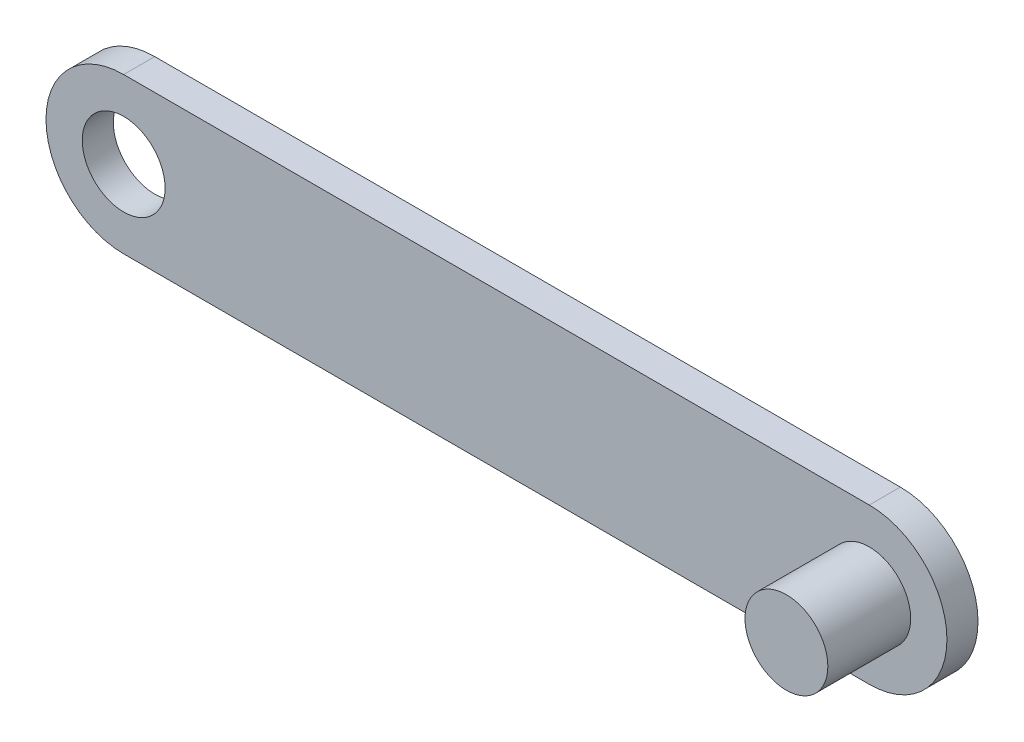
ISO-10303-21;
HEADER;
FILE_DESCRIPTION(('STEP AP214'),'2;1');
FILE_NAME('part.step','',(''),(''),'','','');
FILE_SCHEMA(('AUTOMOTIVE_DESIGN { 1 0 10303 214 1 1 1 1 }'));
ENDSEC;
DATA;
#1=APPLICATION_CONTEXT('core data for automotive mechanical design processes');
#2=APPLICATION_PROTOCOL_DEFINITION('international standard','automotive_design',2000,#1);
#3=PRODUCT_CONTEXT('',#1,'mechanical');
#4=PRODUCT('Part','Part','',(#3));
#5=PRODUCT_RELATED_PRODUCT_CATEGORY('part','',(#4));
#6=PRODUCT_DEFINITION_FORMATION('','',#4);
#7=PRODUCT_DEFINITION_CONTEXT('part definition',#1,'design');
#8=PRODUCT_DEFINITION('design','',#6,#7);
#9=PRODUCT_DEFINITION_SHAPE('','',#8);
#10=(LENGTH_UNIT() NAMED_UNIT(*) SI_UNIT(.MILLI.,.METRE.));
#11=(NAMED_UNIT(*) PLANE_ANGLE_UNIT() SI_UNIT($,.RADIAN.));
#12=(NAMED_UNIT(*) SI_UNIT($,.STERADIAN.) SOLID_ANGLE_UNIT());
#13=UNCERTAINTY_MEASURE_WITH_UNIT(LENGTH_MEASURE(1.E-05),#10,'distance_accuracy_value','');
#14=(GEOMETRIC_REPRESENTATION_CONTEXT(3) GLOBAL_UNCERTAINTY_ASSIGNED_CONTEXT((#13)) GLOBAL_UNIT_ASSIGNED_CONTEXT((#10,
#11,#12)) REPRESENTATION_CONTEXT('',''));
#15=CARTESIAN_POINT('',(0.,0.,0.));
#16=DIRECTION('',(0.,0.,1.));
#17=DIRECTION('',(1.,0.,0.));
#18=AXIS2_PLACEMENT_3D('',#15,#16,#17);
#19=CARTESIAN_POINT('',(0.,0.,3.));
#20=DIRECTION('',(0.,0.,-1.));
#21=DIRECTION('',(-1.,0.,0.));
#22=AXIS2_PLACEMENT_3D('',#19,#20,#21);
#23=CYLINDRICAL_SURFACE('',#22,7.5);
#24=CARTESIAN_POINT('',(0.,0.,0.));
#25=DIRECTION('',(0.,0.,1.));
#26=DIRECTION('',(1.,0.,0.));
#27=AXIS2_PLACEMENT_3D('',#24,#25,#26);
#28=CIRCLE('',#27,7.5);
#29=CARTESIAN_POINT('',(0.,7.5,0.));
#30=VERTEX_POINT('',#29);
#31=CARTESIAN_POINT('',(0.,-7.5,0.));
#32=VERTEX_POINT('',#31);
#33=EDGE_CURVE('E107',#30,#32,#28,.T.);
#34=ORIENTED_EDGE('',*,*,#33,.T.);
#35=DIRECTION('',(0.,0.,-1.));
#36=VECTOR('',#35,1.);
#37=CARTESIAN_POINT('',(0.,-7.5,3.));
#38=LINE('',#37,#36);
#39=CARTESIAN_POINT('',(0.,-7.5,3.));
#40=VERTEX_POINT('',#39);
#41=EDGE_CURVE('E11',#40,#32,#38,.T.);
#42=ORIENTED_EDGE('',*,*,#41,.F.);
#43=CARTESIAN_POINT('',(0.,0.,3.));
#44=DIRECTION('',(0.,0.,1.));
#45=DIRECTION('',(1.,0.,0.));
#46=AXIS2_PLACEMENT_3D('',#43,#44,#45);
#47=CIRCLE('',#46,7.5);
#48=CARTESIAN_POINT('',(0.,7.5,3.));
#49=VERTEX_POINT('',#48);
#50=EDGE_CURVE('E91',#49,#40,#47,.T.);
#51=ORIENTED_EDGE('',*,*,#50,.F.);
#52=DIRECTION('',(0.,0.,-1.));
#53=VECTOR('',#52,1.);
#54=CARTESIAN_POINT('',(0.,7.5,3.));
#55=LINE('',#54,#53);
#56=EDGE_CURVE('E103',#49,#30,#55,.T.);
#57=ORIENTED_EDGE('',*,*,#56,.T.);
#58=EDGE_LOOP('',(#34,#42,#51,#57));
#59=FACE_BOUND('',#58,.T.);
#60=ADVANCED_FACE('F39',(#59),#23,.T.);
#61=CARTESIAN_POINT('',(0.,-7.5,3.));
#62=DIRECTION('',(0.,1.,0.));
#63=DIRECTION('',(-1.,0.,0.));
#64=AXIS2_PLACEMENT_3D('',#61,#62,#63);
#65=PLANE('',#64);
#66=DIRECTION('',(1.,0.,0.));
#67=VECTOR('',#66,1.);
#68=CARTESIAN_POINT('',(0.,-7.5,0.));
#69=LINE('',#68,#67);
#70=CARTESIAN_POINT('',(72.,-7.5,0.));
#71=VERTEX_POINT('',#70);
#72=EDGE_CURVE('E96',#32,#71,#69,.T.);
#73=ORIENTED_EDGE('',*,*,#72,.T.);
#74=DIRECTION('',(0.,0.,-1.));
#75=VECTOR('',#74,1.);
#76=CARTESIAN_POINT('',(72.,-7.5,3.));
#77=LINE('',#76,#75);
#78=CARTESIAN_POINT('',(72.,-7.5,3.));
#79=VERTEX_POINT('',#78);
#80=EDGE_CURVE('E48',#79,#71,#77,.T.);
#81=ORIENTED_EDGE('',*,*,#80,.F.);
#82=DIRECTION('',(1.,0.,0.));
#83=VECTOR('',#82,1.);
#84=CARTESIAN_POINT('',(0.,-7.5,3.));
#85=LINE('',#84,#83);
#86=EDGE_CURVE('E86',#40,#79,#85,.T.);
#87=ORIENTED_EDGE('',*,*,#86,.F.);
#88=ORIENTED_EDGE('',*,*,#41,.T.);
#89=EDGE_LOOP('',(#73,#81,#87,#88));
#90=FACE_BOUND('',#89,.T.);
#91=ADVANCED_FACE('F95',(#90),#65,.F.);
#92=CARTESIAN_POINT('',(72.,0.,3.));
#93=DIRECTION('',(0.,0.,-1.));
#94=DIRECTION('',(-1.,0.,0.));
#95=AXIS2_PLACEMENT_3D('',#92,#93,#94);
#96=CYLINDRICAL_SURFACE('',#95,7.5);
#97=CARTESIAN_POINT('',(72.,0.,0.));
#98=DIRECTION('',(0.,0.,1.));
#99=DIRECTION('',(1.,0.,0.));
#100=AXIS2_PLACEMENT_3D('',#97,#98,#99);
#101=CIRCLE('',#100,7.5);
#102=CARTESIAN_POINT('',(72.,7.5,0.));
#103=VERTEX_POINT('',#102);
#104=EDGE_CURVE('E73',#71,#103,#101,.T.);
#105=ORIENTED_EDGE('',*,*,#104,.T.);
#106=DIRECTION('',(0.,0.,-1.));
#107=VECTOR('',#106,1.);
#108=CARTESIAN_POINT('',(72.,7.5,3.));
#109=LINE('',#108,#107);
#110=CARTESIAN_POINT('',(72.,7.5,3.));
#111=VERTEX_POINT('',#110);
#112=EDGE_CURVE('E98',#111,#103,#109,.T.);
#113=ORIENTED_EDGE('',*,*,#112,.F.);
#114=CARTESIAN_POINT('',(72.,0.,3.));
#115=DIRECTION('',(0.,0.,1.));
#116=DIRECTION('',(1.,0.,0.));
#117=AXIS2_PLACEMENT_3D('',#114,#115,#116);
#118=CIRCLE('',#117,7.5);
#119=EDGE_CURVE('E89',#79,#111,#118,.T.);
#120=ORIENTED_EDGE('',*,*,#119,.F.);
#121=ORIENTED_EDGE('',*,*,#80,.T.);
#122=EDGE_LOOP('',(#105,#113,#120,#121));
#123=FACE_BOUND('',#122,.T.);
#124=ADVANCED_FACE('F99',(#123),#96,.T.);
#125=CARTESIAN_POINT('',(0.,7.5,3.));
#126=DIRECTION('',(0.,-1.,0.));
#127=DIRECTION('',(0.,0.,-1.));
#128=AXIS2_PLACEMENT_3D('',#125,#126,#127);
#129=PLANE('',#128);
#130=DIRECTION('',(-1.,0.,0.));
#131=VECTOR('',#130,1.);
#132=CARTESIAN_POINT('',(0.,7.5,0.));
#133=LINE('',#132,#131);
#134=EDGE_CURVE('E79',#103,#30,#133,.T.);
#135=ORIENTED_EDGE('',*,*,#134,.T.);
#136=ORIENTED_EDGE('',*,*,#56,.F.);
#137=DIRECTION('',(-1.,0.,0.));
#138=VECTOR('',#137,1.);
#139=CARTESIAN_POINT('',(0.,7.5,3.));
#140=LINE('',#139,#138);
#141=EDGE_CURVE('E56',#111,#49,#140,.T.);
#142=ORIENTED_EDGE('',*,*,#141,.F.);
#143=ORIENTED_EDGE('',*,*,#112,.T.);
#144=EDGE_LOOP('',(#135,#136,#142,#143));
#145=FACE_BOUND('',#144,.T.);
#146=ADVANCED_FACE('F121',(#145),#129,.F.);
#147=CARTESIAN_POINT('',(0.,0.,3.));
#148=DIRECTION('',(0.,0.,1.));
#149=DIRECTION('',(1.,0.,0.));
#150=AXIS2_PLACEMENT_3D('',#147,#148,#149);
#151=PLANE('',#150);
#152=CARTESIAN_POINT('',(72.,0.,3.));
#153=DIRECTION('',(0.,0.,1.));
#154=DIRECTION('',(1.,0.,0.));
#155=AXIS2_PLACEMENT_3D('',#152,#153,#154);
#156=CIRCLE('',#155,4.00000000000001);
#157=CARTESIAN_POINT('',(76.,0.,3.));
#158=VERTEX_POINT('',#157);
#159=EDGE_CURVE('E136',#158,#158,#156,.T.);
#160=ORIENTED_EDGE('',*,*,#159,.F.);
#161=EDGE_LOOP('',(#160));
#162=FACE_BOUND('',#161,.T.);
#163=CARTESIAN_POINT('',(0.,0.,3.));
#164=DIRECTION('',(0.,0.,1.));
#165=DIRECTION('',(1.,0.,0.));
#166=AXIS2_PLACEMENT_3D('',#163,#164,#165);
#167=CIRCLE('',#166,4.);
#168=CARTESIAN_POINT('',(4.,0.,3.));
#169=VERTEX_POINT('',#168);
#170=EDGE_CURVE('E128',#169,#169,#167,.T.);
#171=ORIENTED_EDGE('',*,*,#170,.F.);
#172=EDGE_LOOP('',(#171));
#173=FACE_BOUND('',#172,.T.);
#174=ORIENTED_EDGE('',*,*,#50,.T.);
#175=ORIENTED_EDGE('',*,*,#86,.T.);
#176=ORIENTED_EDGE('',*,*,#119,.T.);
#177=ORIENTED_EDGE('',*,*,#141,.T.);
#178=EDGE_LOOP('',(#174,#175,#176,#177));
#179=FACE_BOUND('',#178,.T.);
#180=ADVANCED_FACE('F87',(#162,#173,#179),#151,.T.);
#181=CARTESIAN_POINT('',(0.,0.,0.));
#182=DIRECTION('',(0.,0.,1.));
#183=DIRECTION('',(1.,0.,0.));
#184=AXIS2_PLACEMENT_3D('',#181,#182,#183);
#185=PLANE('',#184);
#186=CARTESIAN_POINT('',(0.,0.,0.));
#187=DIRECTION('',(0.,0.,1.));
#188=DIRECTION('',(1.,0.,0.));
#189=AXIS2_PLACEMENT_3D('',#186,#187,#188);
#190=CIRCLE('',#189,4.);
#191=CARTESIAN_POINT('',(4.,0.,0.));
#192=VERTEX_POINT('',#191);
#193=EDGE_CURVE('E111',#192,#192,#190,.T.);
#194=ORIENTED_EDGE('',*,*,#193,.T.);
#195=EDGE_LOOP('',(#194));
#196=FACE_BOUND('',#195,.T.);
#197=ORIENTED_EDGE('',*,*,#33,.F.);
#198=ORIENTED_EDGE('',*,*,#134,.F.);
#199=ORIENTED_EDGE('',*,*,#104,.F.);
#200=ORIENTED_EDGE('',*,*,#72,.F.);
#201=EDGE_LOOP('',(#197,#198,#199,#200));
#202=FACE_BOUND('',#201,.T.);
#203=ADVANCED_FACE('F124',(#196,#202),#185,.F.);
#204=CARTESIAN_POINT('',(0.,0.,0.));
#205=DIRECTION('',(0.,0.,1.));
#206=DIRECTION('',(1.,0.,0.));
#207=AXIS2_PLACEMENT_3D('',#204,#205,#206);
#208=CYLINDRICAL_SURFACE('',#207,4.);
#209=ORIENTED_EDGE('',*,*,#193,.F.);
#210=EDGE_LOOP('',(#209));
#211=FACE_BOUND('',#210,.T.);
#212=ORIENTED_EDGE('',*,*,#170,.T.);
#213=EDGE_LOOP('',(#212));
#214=FACE_BOUND('',#213,.T.);
#215=ADVANCED_FACE('F149',(#211,#214),#208,.F.);
#216=CARTESIAN_POINT('',(72.,0.,11.));
#217=DIRECTION('',(0.,0.,-1.));
#218=DIRECTION('',(-1.,0.,0.));
#219=AXIS2_PLACEMENT_3D('',#216,#217,#218);
#220=CYLINDRICAL_SURFACE('',#219,4.00000000000001);
#221=CARTESIAN_POINT('',(72.,0.,11.));
#222=DIRECTION('',(0.,0.,1.));
#223=DIRECTION('',(1.,0.,0.));
#224=AXIS2_PLACEMENT_3D('',#221,#222,#223);
#225=CIRCLE('',#224,4.00000000000001);
#226=CARTESIAN_POINT('',(76.,0.,11.));
#227=VERTEX_POINT('',#226);
#228=EDGE_CURVE('E132',#227,#227,#225,.T.);
#229=ORIENTED_EDGE('',*,*,#228,.F.);
#230=EDGE_LOOP('',(#229));
#231=FACE_BOUND('',#230,.T.);
#232=ORIENTED_EDGE('',*,*,#159,.T.);
#233=EDGE_LOOP('',(#232));
#234=FACE_BOUND('',#233,.T.);
#235=ADVANCED_FACE('F146',(#231,#234),#220,.T.);
#236=CARTESIAN_POINT('',(72.,0.,11.));
#237=DIRECTION('',(0.,0.,1.));
#238=DIRECTION('',(1.,0.,0.));
#239=AXIS2_PLACEMENT_3D('',#236,#237,#238);
#240=PLANE('',#239);
#241=ORIENTED_EDGE('',*,*,#228,.T.);
#242=EDGE_LOOP('',(#241));
#243=FACE_BOUND('',#242,.T.);
#244=ADVANCED_FACE('F144',(#243),#240,.T.);
#245=CLOSED_SHELL('',(#60,#91,#124,#146,#180,#203,#215,#235,#244));
#246=MANIFOLD_SOLID_BREP('B2',#245);
#247=ADVANCED_BREP_SHAPE_REPRESENTATION('',(#18,#246),#14);
#248=SHAPE_DEFINITION_REPRESENTATION(#9,#247);
ENDSEC;
END-ISO-10303-21;
